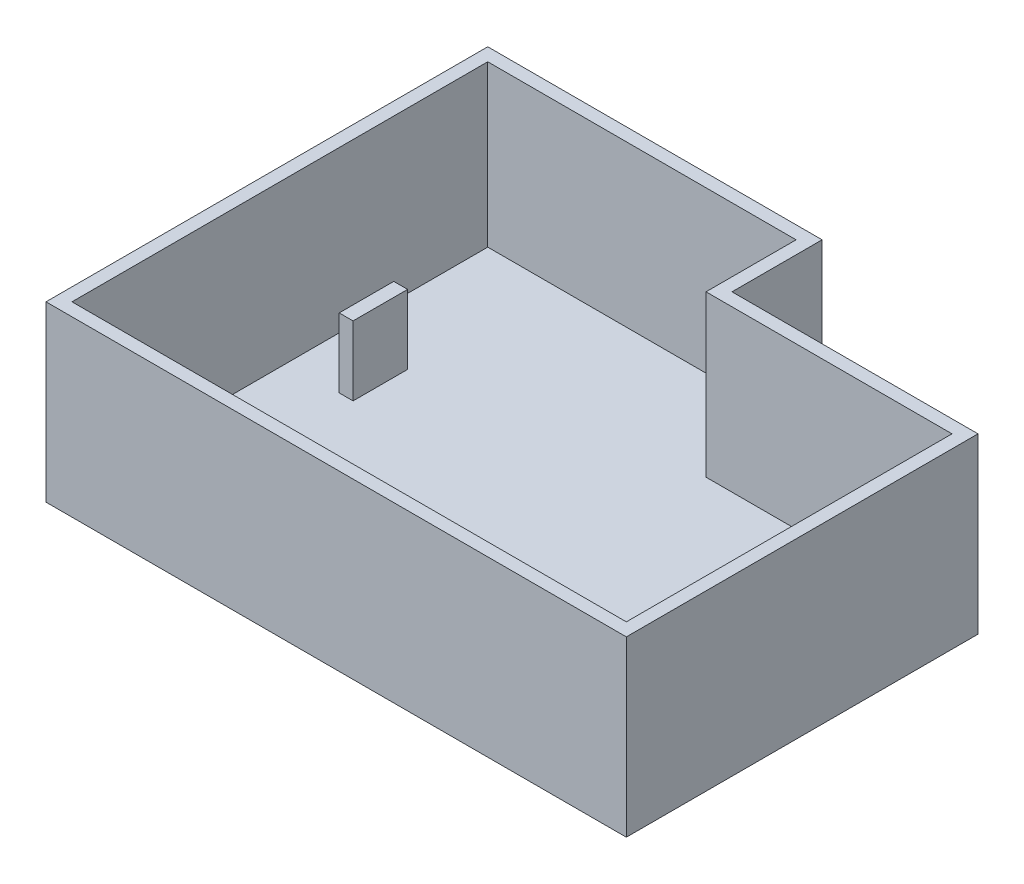
ISO-10303-21;
HEADER;
FILE_DESCRIPTION(('STEP AP214'),'2;1');
FILE_NAME('part.step','',(''),(''),'','','');
FILE_SCHEMA(('AUTOMOTIVE_DESIGN { 1 0 10303 214 1 1 1 1 }'));
ENDSEC;
DATA;
#1=APPLICATION_CONTEXT('core data for automotive mechanical design processes');
#2=APPLICATION_PROTOCOL_DEFINITION('international standard','automotive_design',2000,#1);
#3=PRODUCT_CONTEXT('',#1,'mechanical');
#4=PRODUCT('Part','Part','',(#3));
#5=PRODUCT_RELATED_PRODUCT_CATEGORY('part','',(#4));
#6=PRODUCT_DEFINITION_FORMATION('','',#4);
#7=PRODUCT_DEFINITION_CONTEXT('part definition',#1,'design');
#8=PRODUCT_DEFINITION('design','',#6,#7);
#9=PRODUCT_DEFINITION_SHAPE('','',#8);
#10=(LENGTH_UNIT() NAMED_UNIT(*) SI_UNIT(.MILLI.,.METRE.));
#11=(NAMED_UNIT(*) PLANE_ANGLE_UNIT() SI_UNIT($,.RADIAN.));
#12=(NAMED_UNIT(*) SI_UNIT($,.STERADIAN.) SOLID_ANGLE_UNIT());
#13=UNCERTAINTY_MEASURE_WITH_UNIT(LENGTH_MEASURE(1.E-05),#10,'distance_accuracy_value','');
#14=(GEOMETRIC_REPRESENTATION_CONTEXT(3) GLOBAL_UNCERTAINTY_ASSIGNED_CONTEXT((#13)) GLOBAL_UNIT_ASSIGNED_CONTEXT((#10,
#11,#12)) REPRESENTATION_CONTEXT('',''));
#15=CARTESIAN_POINT('',(0.,0.,0.));
#16=DIRECTION('',(0.,0.,1.));
#17=DIRECTION('',(1.,0.,0.));
#18=AXIS2_PLACEMENT_3D('',#15,#16,#17);
#19=CARTESIAN_POINT('',(0.,4.7625,0.));
#20=DIRECTION('',(0.,1.,0.));
#21=DIRECTION('',(0.,0.,1.));
#22=AXIS2_PLACEMENT_3D('',#19,#20,#21);
#23=PLANE('',#22);
#24=DIRECTION('',(-1.,0.,0.));
#25=VECTOR('',#24,1.);
#26=CARTESIAN_POINT('',(0.,4.7625,-10.));
#27=LINE('',#26,#25);
#28=CARTESIAN_POINT('',(-77.4699999999999,4.7625,-10.));
#29=VERTEX_POINT('',#28);
#30=CARTESIAN_POINT('',(-82.5499999999999,4.7625,-10.));
#31=VERTEX_POINT('',#30);
#32=EDGE_CURVE('E148',#29,#31,#27,.T.);
#33=ORIENTED_EDGE('',*,*,#32,.F.);
#34=DIRECTION('',(0.,0.,-1.));
#35=VECTOR('',#34,1.);
#36=CARTESIAN_POINT('',(-77.4699999999999,4.7625,-17.8901525748163));
#37=LINE('',#36,#35);
#38=CARTESIAN_POINT('',(-77.4699999999999,4.7625,9.99999999999999));
#39=VERTEX_POINT('',#38);
#40=EDGE_CURVE('E285',#39,#29,#37,.T.);
#41=ORIENTED_EDGE('',*,*,#40,.F.);
#42=DIRECTION('',(-1.,0.,0.));
#43=VECTOR('',#42,1.);
#44=CARTESIAN_POINT('',(0.,4.7625,9.99999999999996));
#45=LINE('',#44,#43);
#46=CARTESIAN_POINT('',(-82.5499999999999,4.7625,10.));
#47=VERTEX_POINT('',#46);
#48=EDGE_CURVE('E152',#39,#47,#45,.T.);
#49=ORIENTED_EDGE('',*,*,#48,.T.);
#50=DIRECTION('',(0.,0.,-1.));
#51=VECTOR('',#50,1.);
#52=CARTESIAN_POINT('',(-82.5499999999999,4.7625,0.));
#53=LINE('',#52,#51);
#54=EDGE_CURVE('E155',#47,#31,#53,.T.);
#55=ORIENTED_EDGE('',*,*,#54,.T.);
#56=EDGE_LOOP('',(#33,#41,#49,#55));
#57=FACE_BOUND('',#56,.T.);
#58=DIRECTION('',(1.,0.,0.));
#59=VECTOR('',#58,1.);
#60=CARTESIAN_POINT('',(0.,4.7625,38.575));
#61=LINE('',#60,#59);
#62=CARTESIAN_POINT('',(77.4700000000001,4.7625,38.575));
#63=VERTEX_POINT('',#62);
#64=CARTESIAN_POINT('',(82.5500000000001,4.7625,38.575));
#65=VERTEX_POINT('',#64);
#66=EDGE_CURVE('E218',#63,#65,#61,.T.);
#67=ORIENTED_EDGE('',*,*,#66,.F.);
#68=DIRECTION('',(0.,0.,1.));
#69=VECTOR('',#68,1.);
#70=CARTESIAN_POINT('',(77.4700000000001,4.7625,-17.8901525748163));
#71=LINE('',#70,#69);
#72=CARTESIAN_POINT('',(77.4700000000001,4.7625,18.575));
#73=VERTEX_POINT('',#72);
#74=EDGE_CURVE('E288',#73,#63,#71,.T.);
#75=ORIENTED_EDGE('',*,*,#74,.F.);
#76=DIRECTION('',(1.,0.,0.));
#77=VECTOR('',#76,1.);
#78=CARTESIAN_POINT('',(0.,4.7625,18.575));
#79=LINE('',#78,#77);
#80=CARTESIAN_POINT('',(82.5500000000001,4.7625,18.575));
#81=VERTEX_POINT('',#80);
#82=EDGE_CURVE('E211',#73,#81,#79,.T.);
#83=ORIENTED_EDGE('',*,*,#82,.T.);
#84=DIRECTION('',(0.,0.,-1.));
#85=VECTOR('',#84,1.);
#86=CARTESIAN_POINT('',(82.5500000000001,4.7625,0.));
#87=LINE('',#86,#85);
#88=EDGE_CURVE('E215',#65,#81,#87,.T.);
#89=ORIENTED_EDGE('',*,*,#88,.F.);
#90=EDGE_LOOP('',(#67,#75,#83,#89));
#91=FACE_BOUND('',#90,.T.);
#92=DIRECTION('',(0.,0.,-1.));
#93=VECTOR('',#92,1.);
#94=CARTESIAN_POINT('',(-10.,4.7625,0.));
#95=LINE('',#94,#93);
#96=CARTESIAN_POINT('',(-9.99999999999999,4.7625,69.85));
#97=VERTEX_POINT('',#96);
#98=CARTESIAN_POINT('',(-9.99999999999999,4.7625,64.77));
#99=VERTEX_POINT('',#98);
#100=EDGE_CURVE('E180',#97,#99,#95,.T.);
#101=ORIENTED_EDGE('',*,*,#100,.T.);
#102=DIRECTION('',(-1.,0.,0.));
#103=VECTOR('',#102,1.);
#104=CARTESIAN_POINT('',(-77.4699999999999,4.7625,64.77));
#105=LINE('',#104,#103);
#106=CARTESIAN_POINT('',(10.,4.7625,64.77));
#107=VERTEX_POINT('',#106);
#108=EDGE_CURVE('E272',#107,#99,#105,.T.);
#109=ORIENTED_EDGE('',*,*,#108,.F.);
#110=DIRECTION('',(0.,0.,-1.));
#111=VECTOR('',#110,1.);
#112=CARTESIAN_POINT('',(10.,4.7625,0.));
#113=LINE('',#112,#111);
#114=CARTESIAN_POINT('',(10.,4.7625,69.85));
#115=VERTEX_POINT('',#114);
#116=EDGE_CURVE('E53',#115,#107,#113,.T.);
#117=ORIENTED_EDGE('',*,*,#116,.F.);
#118=DIRECTION('',(1.,0.,0.));
#119=VECTOR('',#118,1.);
#120=CARTESIAN_POINT('',(0.,4.7625,69.85));
#121=LINE('',#120,#119);
#122=EDGE_CURVE('E185',#97,#115,#121,.T.);
#123=ORIENTED_EDGE('',*,*,#122,.F.);
#124=EDGE_LOOP('',(#101,#109,#117,#123));
#125=FACE_BOUND('',#124,.T.);
#126=DIRECTION('',(0.,0.,1.));
#127=VECTOR('',#126,1.);
#128=CARTESIAN_POINT('',(11.4300000000001,4.7625,0.));
#129=LINE('',#128,#127);
#130=CARTESIAN_POINT('',(11.4300000000001,4.7625,-63.5));
#131=VERTEX_POINT('',#130);
#132=CARTESIAN_POINT('',(11.4300000000001,4.7625,-30.48));
#133=VERTEX_POINT('',#132);
#134=EDGE_CURVE('E234',#131,#133,#129,.T.);
#135=ORIENTED_EDGE('',*,*,#134,.F.);
#136=DIRECTION('',(1.,0.,0.));
#137=VECTOR('',#136,1.);
#138=CARTESIAN_POINT('',(0.,4.7625,-63.5));
#139=LINE('',#138,#137);
#140=CARTESIAN_POINT('',(-101.6,4.7625,-63.5));
#141=VERTEX_POINT('',#140);
#142=EDGE_CURVE('E132',#141,#131,#139,.T.);
#143=ORIENTED_EDGE('',*,*,#142,.F.);
#144=DIRECTION('',(0.,0.,-1.));
#145=VECTOR('',#144,1.);
#146=CARTESIAN_POINT('',(-101.6,4.7625,0.));
#147=LINE('',#146,#145);
#148=CARTESIAN_POINT('',(-101.6,4.7625,88.9));
#149=VERTEX_POINT('',#148);
#150=EDGE_CURVE('E127',#149,#141,#147,.T.);
#151=ORIENTED_EDGE('',*,*,#150,.F.);
#152=DIRECTION('',(1.,0.,0.));
#153=VECTOR('',#152,1.);
#154=CARTESIAN_POINT('',(0.,4.7625,88.9));
#155=LINE('',#154,#153);
#156=CARTESIAN_POINT('',(101.6,4.7625,88.9));
#157=VERTEX_POINT('',#156);
#158=EDGE_CURVE('E122',#149,#157,#155,.T.);
#159=ORIENTED_EDGE('',*,*,#158,.T.);
#160=DIRECTION('',(0.,0.,-1.));
#161=VECTOR('',#160,1.);
#162=CARTESIAN_POINT('',(101.6,4.7625,0.));
#163=LINE('',#162,#161);
#164=CARTESIAN_POINT('',(101.6,4.7625,-30.48));
#165=VERTEX_POINT('',#164);
#166=EDGE_CURVE('E119',#157,#165,#163,.T.);
#167=ORIENTED_EDGE('',*,*,#166,.T.);
#168=DIRECTION('',(1.,0.,0.));
#169=VECTOR('',#168,1.);
#170=CARTESIAN_POINT('',(0.,4.7625,-30.48));
#171=LINE('',#170,#169);
#172=EDGE_CURVE('E221',#133,#165,#171,.T.);
#173=ORIENTED_EDGE('',*,*,#172,.F.);
#174=EDGE_LOOP('',(#135,#143,#151,#159,#167,#173));
#175=FACE_BOUND('',#174,.T.);
#176=ADVANCED_FACE('F38',(#57,#91,#125,#175),#23,.T.);
#177=CARTESIAN_POINT('',(0.,63.607999784,0.));
#178=DIRECTION('',(0.,1.,0.));
#179=DIRECTION('',(0.,0.,1.));
#180=AXIS2_PLACEMENT_3D('',#177,#178,#179);
#181=PLANE('',#180);
#182=DIRECTION('',(0.,0.,-1.));
#183=VECTOR('',#182,1.);
#184=CARTESIAN_POINT('',(16.1925000000001,63.607999784,-93.6625));
#185=LINE('',#184,#183);
#186=CARTESIAN_POINT('',(16.1925000000001,63.607999784,-35.2425));
#187=VERTEX_POINT('',#186);
#188=CARTESIAN_POINT('',(16.1925000000001,63.607999784,-68.2625));
#189=VERTEX_POINT('',#188);
#190=EDGE_CURVE('E237',#187,#189,#185,.T.);
#191=ORIENTED_EDGE('',*,*,#190,.T.);
#192=DIRECTION('',(-1.,0.,0.));
#193=VECTOR('',#192,1.);
#194=CARTESIAN_POINT('',(-106.3625,63.607999784,-68.2625));
#195=LINE('',#194,#193);
#196=CARTESIAN_POINT('',(-106.3625,63.607999784,-68.2625));
#197=VERTEX_POINT('',#196);
#198=EDGE_CURVE('E276',#189,#197,#195,.T.);
#199=ORIENTED_EDGE('',*,*,#198,.T.);
#200=DIRECTION('',(0.,0.,-1.));
#201=VECTOR('',#200,1.);
#202=CARTESIAN_POINT('',(-106.3625,63.607999784,0.));
#203=LINE('',#202,#201);
#204=CARTESIAN_POINT('',(-106.3625,63.607999784,93.6625));
#205=VERTEX_POINT('',#204);
#206=EDGE_CURVE('E100',#205,#197,#203,.T.);
#207=ORIENTED_EDGE('',*,*,#206,.F.);
#208=DIRECTION('',(1.,0.,0.));
#209=VECTOR('',#208,1.);
#210=CARTESIAN_POINT('',(0.,63.607999784,93.6625));
#211=LINE('',#210,#209);
#212=CARTESIAN_POINT('',(106.3625,63.607999784,93.6625));
#213=VERTEX_POINT('',#212);
#214=EDGE_CURVE('E62',#205,#213,#211,.T.);
#215=ORIENTED_EDGE('',*,*,#214,.T.);
#216=DIRECTION('',(0.,0.,-1.));
#217=VECTOR('',#216,1.);
#218=CARTESIAN_POINT('',(106.3625,63.607999784,0.));
#219=LINE('',#218,#217);
#220=CARTESIAN_POINT('',(106.3625,63.607999784,-35.2425));
#221=VERTEX_POINT('',#220);
#222=EDGE_CURVE('E93',#213,#221,#219,.T.);
#223=ORIENTED_EDGE('',*,*,#222,.T.);
#224=DIRECTION('',(-1.,0.,0.));
#225=VECTOR('',#224,1.);
#226=CARTESIAN_POINT('',(16.1925000000001,63.607999784,-35.2425));
#227=LINE('',#226,#225);
#228=EDGE_CURVE('E254',#221,#187,#227,.T.);
#229=ORIENTED_EDGE('',*,*,#228,.T.);
#230=EDGE_LOOP('',(#191,#199,#207,#215,#223,#229));
#231=FACE_BOUND('',#230,.T.);
#232=DIRECTION('',(1.,0.,0.));
#233=VECTOR('',#232,1.);
#234=CARTESIAN_POINT('',(-106.3625,63.607999784,-63.5));
#235=LINE('',#234,#233);
#236=CARTESIAN_POINT('',(-101.6,63.607999784,-63.5));
#237=VERTEX_POINT('',#236);
#238=CARTESIAN_POINT('',(11.4300000000001,63.607999784,-63.5));
#239=VERTEX_POINT('',#238);
#240=EDGE_CURVE('E267',#237,#239,#235,.T.);
#241=ORIENTED_EDGE('',*,*,#240,.T.);
#242=DIRECTION('',(0.,0.,1.));
#243=VECTOR('',#242,1.);
#244=CARTESIAN_POINT('',(11.4300000000001,63.607999784,-30.48));
#245=LINE('',#244,#243);
#246=CARTESIAN_POINT('',(11.4300000000001,63.607999784,-30.48));
#247=VERTEX_POINT('',#246);
#248=EDGE_CURVE('E248',#239,#247,#245,.T.);
#249=ORIENTED_EDGE('',*,*,#248,.T.);
#250=DIRECTION('',(1.,0.,0.));
#251=VECTOR('',#250,1.);
#252=CARTESIAN_POINT('',(106.3625,63.607999784,-30.48));
#253=LINE('',#252,#251);
#254=CARTESIAN_POINT('',(101.6,63.607999784,-30.48));
#255=VERTEX_POINT('',#254);
#256=EDGE_CURVE('E251',#247,#255,#253,.T.);
#257=ORIENTED_EDGE('',*,*,#256,.T.);
#258=DIRECTION('',(0.,0.,-1.));
#259=VECTOR('',#258,1.);
#260=CARTESIAN_POINT('',(101.6,63.607999784,0.));
#261=LINE('',#260,#259);
#262=CARTESIAN_POINT('',(101.6,63.607999784,88.9));
#263=VERTEX_POINT('',#262);
#264=EDGE_CURVE('E109',#263,#255,#261,.T.);
#265=ORIENTED_EDGE('',*,*,#264,.F.);
#266=DIRECTION('',(1.,0.,0.));
#267=VECTOR('',#266,1.);
#268=CARTESIAN_POINT('',(0.,63.607999784,88.9));
#269=LINE('',#268,#267);
#270=CARTESIAN_POINT('',(-101.6,63.607999784,88.9));
#271=VERTEX_POINT('',#270);
#272=EDGE_CURVE('E113',#271,#263,#269,.T.);
#273=ORIENTED_EDGE('',*,*,#272,.F.);
#274=DIRECTION('',(0.,0.,-1.));
#275=VECTOR('',#274,1.);
#276=CARTESIAN_POINT('',(-101.6,63.607999784,0.));
#277=LINE('',#276,#275);
#278=EDGE_CURVE('E116',#271,#237,#277,.T.);
#279=ORIENTED_EDGE('',*,*,#278,.T.);
#280=EDGE_LOOP('',(#241,#249,#257,#265,#273,#279));
#281=FACE_BOUND('',#280,.T.);
#282=ADVANCED_FACE('F375',(#231,#281),#181,.T.);
#283=CARTESIAN_POINT('',(-106.3625,63.607999784,0.));
#284=DIRECTION('',(-1.,0.,0.));
#285=DIRECTION('',(0.,0.,1.));
#286=AXIS2_PLACEMENT_3D('',#283,#284,#285);
#287=PLANE('',#286);
#288=ORIENTED_EDGE('',*,*,#206,.T.);
#289=DIRECTION('',(0.,-1.,0.));
#290=VECTOR('',#289,1.);
#291=CARTESIAN_POINT('',(-106.3625,186.255500497427,-68.2625));
#292=LINE('',#291,#290);
#293=CARTESIAN_POINT('',(-106.3625,0.,-68.2625));
#294=VERTEX_POINT('',#293);
#295=EDGE_CURVE('E268',#197,#294,#292,.T.);
#296=ORIENTED_EDGE('',*,*,#295,.T.);
#297=DIRECTION('',(0.,0.,-1.));
#298=VECTOR('',#297,1.);
#299=CARTESIAN_POINT('',(-106.3625,0.,0.));
#300=LINE('',#299,#298);
#301=CARTESIAN_POINT('',(-106.3625,0.,93.6625));
#302=VERTEX_POINT('',#301);
#303=EDGE_CURVE('E85',#302,#294,#300,.T.);
#304=ORIENTED_EDGE('',*,*,#303,.F.);
#305=DIRECTION('',(0.,-1.,0.));
#306=VECTOR('',#305,1.);
#307=CARTESIAN_POINT('',(-106.3625,63.607999784,93.6625));
#308=LINE('',#307,#306);
#309=EDGE_CURVE('E46',#205,#302,#308,.T.);
#310=ORIENTED_EDGE('',*,*,#309,.F.);
#311=EDGE_LOOP('',(#288,#296,#304,#310));
#312=FACE_BOUND('',#311,.T.);
#313=ADVANCED_FACE('F40',(#312),#287,.T.);
#314=CARTESIAN_POINT('',(0.,0.,0.));
#315=DIRECTION('',(0.,1.,0.));
#316=DIRECTION('',(0.,0.,1.));
#317=AXIS2_PLACEMENT_3D('',#314,#315,#316);
#318=PLANE('',#317);
#319=ORIENTED_EDGE('',*,*,#303,.T.);
#320=DIRECTION('',(-1.,0.,0.));
#321=VECTOR('',#320,1.);
#322=CARTESIAN_POINT('',(-106.3625,0.,-68.2625));
#323=LINE('',#322,#321);
#324=CARTESIAN_POINT('',(16.1925000000001,0.,-68.2625));
#325=VERTEX_POINT('',#324);
#326=EDGE_CURVE('E275',#325,#294,#323,.T.);
#327=ORIENTED_EDGE('',*,*,#326,.F.);
#328=DIRECTION('',(0.,0.,-1.));
#329=VECTOR('',#328,1.);
#330=CARTESIAN_POINT('',(16.1925000000001,0.,-93.6625));
#331=LINE('',#330,#329);
#332=CARTESIAN_POINT('',(16.1925000000001,0.,-35.2425));
#333=VERTEX_POINT('',#332);
#334=EDGE_CURVE('E241',#333,#325,#331,.T.);
#335=ORIENTED_EDGE('',*,*,#334,.F.);
#336=DIRECTION('',(-1.,0.,0.));
#337=VECTOR('',#336,1.);
#338=CARTESIAN_POINT('',(16.1925000000001,0.,-35.2425));
#339=LINE('',#338,#337);
#340=CARTESIAN_POINT('',(106.3625,0.,-35.2425));
#341=VERTEX_POINT('',#340);
#342=EDGE_CURVE('E99',#341,#333,#339,.T.);
#343=ORIENTED_EDGE('',*,*,#342,.F.);
#344=DIRECTION('',(0.,0.,-1.));
#345=VECTOR('',#344,1.);
#346=CARTESIAN_POINT('',(106.3625,0.,0.));
#347=LINE('',#346,#345);
#348=CARTESIAN_POINT('',(106.3625,0.,93.6625));
#349=VERTEX_POINT('',#348);
#350=EDGE_CURVE('E84',#349,#341,#347,.T.);
#351=ORIENTED_EDGE('',*,*,#350,.F.);
#352=DIRECTION('',(1.,0.,0.));
#353=VECTOR('',#352,1.);
#354=CARTESIAN_POINT('',(0.,0.,93.6625));
#355=LINE('',#354,#353);
#356=EDGE_CURVE('E75',#302,#349,#355,.T.);
#357=ORIENTED_EDGE('',*,*,#356,.F.);
#358=EDGE_LOOP('',(#319,#327,#335,#343,#351,#357));
#359=FACE_BOUND('',#358,.T.);
#360=ADVANCED_FACE('F96',(#359),#318,.F.);
#361=CARTESIAN_POINT('',(-101.6,63.607999784,0.));
#362=DIRECTION('',(-1.,0.,0.));
#363=DIRECTION('',(0.,0.,1.));
#364=AXIS2_PLACEMENT_3D('',#361,#362,#363);
#365=PLANE('',#364);
#366=DIRECTION('',(0.,-1.,0.));
#367=VECTOR('',#366,1.);
#368=CARTESIAN_POINT('',(-101.6,63.607999784,-63.5));
#369=LINE('',#368,#367);
#370=EDGE_CURVE('E247',#237,#141,#369,.T.);
#371=ORIENTED_EDGE('',*,*,#370,.F.);
#372=ORIENTED_EDGE('',*,*,#278,.F.);
#373=DIRECTION('',(0.,-1.,0.));
#374=VECTOR('',#373,1.);
#375=CARTESIAN_POINT('',(-101.6,63.607999784,88.9));
#376=LINE('',#375,#374);
#377=EDGE_CURVE('E106',#271,#149,#376,.T.);
#378=ORIENTED_EDGE('',*,*,#377,.T.);
#379=ORIENTED_EDGE('',*,*,#150,.T.);
#380=EDGE_LOOP('',(#371,#372,#378,#379));
#381=FACE_BOUND('',#380,.T.);
#382=ADVANCED_FACE('F469',(#381),#365,.F.);
#383=CARTESIAN_POINT('',(11.4300000000001,177.643993498704,-30.48));
#384=DIRECTION('',(1.,0.,0.));
#385=DIRECTION('',(0.,0.,-1.));
#386=AXIS2_PLACEMENT_3D('',#383,#384,#385);
#387=PLANE('',#386);
#388=DIRECTION('',(0.,1.,0.));
#389=VECTOR('',#388,1.);
#390=CARTESIAN_POINT('',(11.4300000000001,177.643993498704,-63.5));
#391=LINE('',#390,#389);
#392=EDGE_CURVE('E264',#131,#239,#391,.T.);
#393=ORIENTED_EDGE('',*,*,#392,.F.);
#394=ORIENTED_EDGE('',*,*,#134,.T.);
#395=DIRECTION('',(0.,-1.,0.));
#396=VECTOR('',#395,1.);
#397=CARTESIAN_POINT('',(11.4300000000001,177.643993498704,-30.48));
#398=LINE('',#397,#396);
#399=EDGE_CURVE('E244',#247,#133,#398,.T.);
#400=ORIENTED_EDGE('',*,*,#399,.F.);
#401=ORIENTED_EDGE('',*,*,#248,.F.);
#402=EDGE_LOOP('',(#393,#394,#400,#401));
#403=FACE_BOUND('',#402,.T.);
#404=ADVANCED_FACE('F390',(#403),#387,.F.);
#405=CARTESIAN_POINT('',(16.1925000000001,177.643993498704,-93.6625));
#406=DIRECTION('',(-1.,0.,0.));
#407=DIRECTION('',(0.,0.,1.));
#408=AXIS2_PLACEMENT_3D('',#405,#406,#407);
#409=PLANE('',#408);
#410=ORIENTED_EDGE('',*,*,#334,.T.);
#411=DIRECTION('',(0.,-1.,0.));
#412=VECTOR('',#411,1.);
#413=CARTESIAN_POINT('',(16.1925000000001,186.255500497427,-68.2625));
#414=LINE('',#413,#412);
#415=EDGE_CURVE('E271',#189,#325,#414,.T.);
#416=ORIENTED_EDGE('',*,*,#415,.F.);
#417=ORIENTED_EDGE('',*,*,#190,.F.);
#418=DIRECTION('',(0.,-1.,0.));
#419=VECTOR('',#418,1.);
#420=CARTESIAN_POINT('',(16.1925000000001,177.643993498704,-35.2425));
#421=LINE('',#420,#419);
#422=EDGE_CURVE('E238',#187,#333,#421,.T.);
#423=ORIENTED_EDGE('',*,*,#422,.T.);
#424=EDGE_LOOP('',(#410,#416,#417,#423));
#425=FACE_BOUND('',#424,.T.);
#426=ADVANCED_FACE('F472',(#425),#409,.F.);
#427=CARTESIAN_POINT('',(0.,63.607999784,93.6625));
#428=DIRECTION('',(0.,0.,-1.));
#429=DIRECTION('',(-1.,0.,0.));
#430=AXIS2_PLACEMENT_3D('',#427,#428,#429);
#431=PLANE('',#430);
#432=ORIENTED_EDGE('',*,*,#356,.T.);
#433=DIRECTION('',(0.,-1.,0.));
#434=VECTOR('',#433,1.);
#435=CARTESIAN_POINT('',(106.3625,63.607999784,93.6625));
#436=LINE('',#435,#434);
#437=EDGE_CURVE('E78',#213,#349,#436,.T.);
#438=ORIENTED_EDGE('',*,*,#437,.F.);
#439=ORIENTED_EDGE('',*,*,#214,.F.);
#440=ORIENTED_EDGE('',*,*,#309,.T.);
#441=EDGE_LOOP('',(#432,#438,#439,#440));
#442=FACE_BOUND('',#441,.T.);
#443=ADVANCED_FACE('F77',(#442),#431,.F.);
#444=CARTESIAN_POINT('',(106.3625,63.607999784,0.));
#445=DIRECTION('',(-1.,0.,0.));
#446=DIRECTION('',(0.,0.,1.));
#447=AXIS2_PLACEMENT_3D('',#444,#445,#446);
#448=PLANE('',#447);
#449=ORIENTED_EDGE('',*,*,#350,.T.);
#450=DIRECTION('',(0.,-1.,0.));
#451=VECTOR('',#450,1.);
#452=CARTESIAN_POINT('',(106.3625,177.643993498704,-35.2425));
#453=LINE('',#452,#451);
#454=EDGE_CURVE('E242',#221,#341,#453,.T.);
#455=ORIENTED_EDGE('',*,*,#454,.F.);
#456=ORIENTED_EDGE('',*,*,#222,.F.);
#457=ORIENTED_EDGE('',*,*,#437,.T.);
#458=EDGE_LOOP('',(#449,#455,#456,#457));
#459=FACE_BOUND('',#458,.T.);
#460=ADVANCED_FACE('F89',(#459),#448,.F.);
#461=CARTESIAN_POINT('',(0.,63.607999784,88.9));
#462=DIRECTION('',(0.,0.,-1.));
#463=DIRECTION('',(-1.,0.,0.));
#464=AXIS2_PLACEMENT_3D('',#461,#462,#463);
#465=PLANE('',#464);
#466=ORIENTED_EDGE('',*,*,#158,.F.);
#467=ORIENTED_EDGE('',*,*,#377,.F.);
#468=ORIENTED_EDGE('',*,*,#272,.T.);
#469=DIRECTION('',(0.,-1.,0.));
#470=VECTOR('',#469,1.);
#471=CARTESIAN_POINT('',(101.6,63.607999784,88.9));
#472=LINE('',#471,#470);
#473=EDGE_CURVE('E112',#263,#157,#472,.T.);
#474=ORIENTED_EDGE('',*,*,#473,.T.);
#475=EDGE_LOOP('',(#466,#467,#468,#474));
#476=FACE_BOUND('',#475,.T.);
#477=ADVANCED_FACE('F366',(#476),#465,.T.);
#478=CARTESIAN_POINT('',(101.6,63.607999784,0.));
#479=DIRECTION('',(-1.,0.,0.));
#480=DIRECTION('',(0.,0.,1.));
#481=AXIS2_PLACEMENT_3D('',#478,#479,#480);
#482=PLANE('',#481);
#483=DIRECTION('',(0.,1.,0.));
#484=VECTOR('',#483,1.);
#485=CARTESIAN_POINT('',(101.6,63.607999784,-30.48));
#486=LINE('',#485,#484);
#487=EDGE_CURVE('E11',#165,#255,#486,.T.);
#488=ORIENTED_EDGE('',*,*,#487,.F.);
#489=ORIENTED_EDGE('',*,*,#166,.F.);
#490=ORIENTED_EDGE('',*,*,#473,.F.);
#491=ORIENTED_EDGE('',*,*,#264,.T.);
#492=EDGE_LOOP('',(#488,#489,#490,#491));
#493=FACE_BOUND('',#492,.T.);
#494=ADVANCED_FACE('F373',(#493),#482,.T.);
#495=CARTESIAN_POINT('',(-82.5499999999999,30.1625,0.));
#496=DIRECTION('',(-1.,0.,0.));
#497=DIRECTION('',(0.,0.,1.));
#498=AXIS2_PLACEMENT_3D('',#495,#496,#497);
#499=PLANE('',#498);
#500=ORIENTED_EDGE('',*,*,#54,.F.);
#501=DIRECTION('',(0.,-1.,0.));
#502=VECTOR('',#501,1.);
#503=CARTESIAN_POINT('',(-82.5499999999999,30.1625,10.));
#504=LINE('',#503,#502);
#505=CARTESIAN_POINT('',(-82.5499999999999,30.1625,10.));
#506=VERTEX_POINT('',#505);
#507=EDGE_CURVE('E135',#506,#47,#504,.T.);
#508=ORIENTED_EDGE('',*,*,#507,.F.);
#509=DIRECTION('',(0.,0.,-1.));
#510=VECTOR('',#509,1.);
#511=CARTESIAN_POINT('',(-82.5499999999999,30.1625,0.));
#512=LINE('',#511,#510);
#513=CARTESIAN_POINT('',(-82.5499999999999,30.1625,-10.));
#514=VERTEX_POINT('',#513);
#515=EDGE_CURVE('E151',#506,#514,#512,.T.);
#516=ORIENTED_EDGE('',*,*,#515,.T.);
#517=DIRECTION('',(0.,-1.,0.));
#518=VECTOR('',#517,1.);
#519=CARTESIAN_POINT('',(-82.5499999999999,30.1625,-10.));
#520=LINE('',#519,#518);
#521=EDGE_CURVE('E144',#514,#31,#520,.T.);
#522=ORIENTED_EDGE('',*,*,#521,.T.);
#523=EDGE_LOOP('',(#500,#508,#516,#522));
#524=FACE_BOUND('',#523,.T.);
#525=ADVANCED_FACE('F440',(#524),#499,.T.);
#526=CARTESIAN_POINT('',(0.,30.1625,9.99999999999996));
#527=DIRECTION('',(0.,0.,1.));
#528=DIRECTION('',(1.,0.,0.));
#529=AXIS2_PLACEMENT_3D('',#526,#527,#528);
#530=PLANE('',#529);
#531=ORIENTED_EDGE('',*,*,#48,.F.);
#532=DIRECTION('',(0.,-1.,0.));
#533=VECTOR('',#532,1.);
#534=CARTESIAN_POINT('',(-77.4699999999999,30.1625,9.99999999999999));
#535=LINE('',#534,#533);
#536=CARTESIAN_POINT('',(-77.4699999999999,30.1625,9.99999999999999));
#537=VERTEX_POINT('',#536);
#538=EDGE_CURVE('E138',#537,#39,#535,.T.);
#539=ORIENTED_EDGE('',*,*,#538,.F.);
#540=DIRECTION('',(-1.,0.,0.));
#541=VECTOR('',#540,1.);
#542=CARTESIAN_POINT('',(0.,30.1625,9.99999999999996));
#543=LINE('',#542,#541);
#544=EDGE_CURVE('E164',#537,#506,#543,.T.);
#545=ORIENTED_EDGE('',*,*,#544,.T.);
#546=ORIENTED_EDGE('',*,*,#507,.T.);
#547=EDGE_LOOP('',(#531,#539,#545,#546));
#548=FACE_BOUND('',#547,.T.);
#549=ADVANCED_FACE('F436',(#548),#530,.T.);
#550=CARTESIAN_POINT('',(-77.4699999999999,30.1625,0.));
#551=DIRECTION('',(1.,0.,0.));
#552=DIRECTION('',(0.,0.,-1.));
#553=AXIS2_PLACEMENT_3D('',#550,#551,#552);
#554=PLANE('',#553);
#555=ORIENTED_EDGE('',*,*,#538,.T.);
#556=ORIENTED_EDGE('',*,*,#40,.T.);
#557=DIRECTION('',(0.,-1.,0.));
#558=VECTOR('',#557,1.);
#559=CARTESIAN_POINT('',(-77.4699999999999,30.1625,-10.));
#560=LINE('',#559,#558);
#561=CARTESIAN_POINT('',(-77.4699999999999,30.1625,-10.));
#562=VERTEX_POINT('',#561);
#563=EDGE_CURVE('E141',#562,#29,#560,.T.);
#564=ORIENTED_EDGE('',*,*,#563,.F.);
#565=DIRECTION('',(0.,0.,1.));
#566=VECTOR('',#565,1.);
#567=CARTESIAN_POINT('',(-77.4699999999999,30.1625,0.));
#568=LINE('',#567,#566);
#569=EDGE_CURVE('E161',#562,#537,#568,.T.);
#570=ORIENTED_EDGE('',*,*,#569,.T.);
#571=EDGE_LOOP('',(#555,#556,#564,#570));
#572=FACE_BOUND('',#571,.T.);
#573=ADVANCED_FACE('F429',(#572),#554,.T.);
#574=CARTESIAN_POINT('',(0.,30.1625,-10.));
#575=DIRECTION('',(0.,0.,1.));
#576=DIRECTION('',(1.,0.,0.));
#577=AXIS2_PLACEMENT_3D('',#574,#575,#576);
#578=PLANE('',#577);
#579=ORIENTED_EDGE('',*,*,#563,.T.);
#580=ORIENTED_EDGE('',*,*,#32,.T.);
#581=ORIENTED_EDGE('',*,*,#521,.F.);
#582=DIRECTION('',(-1.,0.,0.));
#583=VECTOR('',#582,1.);
#584=CARTESIAN_POINT('',(0.,30.1625,-10.));
#585=LINE('',#584,#583);
#586=EDGE_CURVE('E147',#562,#514,#585,.T.);
#587=ORIENTED_EDGE('',*,*,#586,.F.);
#588=EDGE_LOOP('',(#579,#580,#581,#587));
#589=FACE_BOUND('',#588,.T.);
#590=ADVANCED_FACE('F444',(#589),#578,.F.);
#591=CARTESIAN_POINT('',(0.,30.1625,0.));
#592=DIRECTION('',(0.,1.,0.));
#593=DIRECTION('',(0.,0.,1.));
#594=AXIS2_PLACEMENT_3D('',#591,#592,#593);
#595=PLANE('',#594);
#596=ORIENTED_EDGE('',*,*,#515,.F.);
#597=ORIENTED_EDGE('',*,*,#544,.F.);
#598=ORIENTED_EDGE('',*,*,#569,.F.);
#599=ORIENTED_EDGE('',*,*,#586,.T.);
#600=EDGE_LOOP('',(#596,#597,#598,#599));
#601=FACE_BOUND('',#600,.T.);
#602=ADVANCED_FACE('F446',(#601),#595,.T.);
#603=CARTESIAN_POINT('',(0.,30.1625,69.85));
#604=DIRECTION('',(0.,0.,-1.));
#605=DIRECTION('',(-1.,0.,0.));
#606=AXIS2_PLACEMENT_3D('',#603,#604,#605);
#607=PLANE('',#606);
#608=ORIENTED_EDGE('',*,*,#122,.T.);
#609=DIRECTION('',(0.,-1.,0.));
#610=VECTOR('',#609,1.);
#611=CARTESIAN_POINT('',(10.,30.1625,69.85));
#612=LINE('',#611,#610);
#613=CARTESIAN_POINT('',(10.,30.1625,69.85));
#614=VERTEX_POINT('',#613);
#615=EDGE_CURVE('E158',#614,#115,#612,.T.);
#616=ORIENTED_EDGE('',*,*,#615,.F.);
#617=DIRECTION('',(1.,0.,0.));
#618=VECTOR('',#617,1.);
#619=CARTESIAN_POINT('',(0.,30.1625,69.85));
#620=LINE('',#619,#618);
#621=CARTESIAN_POINT('',(-9.99999999999999,30.1625,69.85));
#622=VERTEX_POINT('',#621);
#623=EDGE_CURVE('E183',#622,#614,#620,.T.);
#624=ORIENTED_EDGE('',*,*,#623,.F.);
#625=DIRECTION('',(0.,-1.,0.));
#626=VECTOR('',#625,1.);
#627=CARTESIAN_POINT('',(-9.99999999999999,30.1625,69.85));
#628=LINE('',#627,#626);
#629=EDGE_CURVE('E176',#622,#97,#628,.T.);
#630=ORIENTED_EDGE('',*,*,#629,.T.);
#631=EDGE_LOOP('',(#608,#616,#624,#630));
#632=FACE_BOUND('',#631,.T.);
#633=ADVANCED_FACE('F448',(#632),#607,.F.);
#634=CARTESIAN_POINT('',(10.,30.1625,0.));
#635=DIRECTION('',(-1.,0.,0.));
#636=DIRECTION('',(0.,0.,1.));
#637=AXIS2_PLACEMENT_3D('',#634,#635,#636);
#638=PLANE('',#637);
#639=ORIENTED_EDGE('',*,*,#116,.T.);
#640=DIRECTION('',(0.,-1.,0.));
#641=VECTOR('',#640,1.);
#642=CARTESIAN_POINT('',(10.,30.1625,64.77));
#643=LINE('',#642,#641);
#644=CARTESIAN_POINT('',(10.,30.1625,64.77));
#645=VERTEX_POINT('',#644);
#646=EDGE_CURVE('E170',#645,#107,#643,.T.);
#647=ORIENTED_EDGE('',*,*,#646,.F.);
#648=DIRECTION('',(0.,0.,-1.));
#649=VECTOR('',#648,1.);
#650=CARTESIAN_POINT('',(10.,30.1625,0.));
#651=LINE('',#650,#649);
#652=EDGE_CURVE('E194',#614,#645,#651,.T.);
#653=ORIENTED_EDGE('',*,*,#652,.F.);
#654=ORIENTED_EDGE('',*,*,#615,.T.);
#655=EDGE_LOOP('',(#639,#647,#653,#654));
#656=FACE_BOUND('',#655,.T.);
#657=ADVANCED_FACE('F454',(#656),#638,.F.);
#658=CARTESIAN_POINT('',(0.,30.1625,64.77));
#659=DIRECTION('',(0.,0.,1.));
#660=DIRECTION('',(1.,0.,0.));
#661=AXIS2_PLACEMENT_3D('',#658,#659,#660);
#662=PLANE('',#661);
#663=ORIENTED_EDGE('',*,*,#646,.T.);
#664=ORIENTED_EDGE('',*,*,#108,.T.);
#665=DIRECTION('',(0.,-1.,0.));
#666=VECTOR('',#665,1.);
#667=CARTESIAN_POINT('',(-9.99999999999999,30.1625,64.77));
#668=LINE('',#667,#666);
#669=CARTESIAN_POINT('',(-9.99999999999999,30.1625,64.77));
#670=VERTEX_POINT('',#669);
#671=EDGE_CURVE('E173',#670,#99,#668,.T.);
#672=ORIENTED_EDGE('',*,*,#671,.F.);
#673=DIRECTION('',(-1.,0.,0.));
#674=VECTOR('',#673,1.);
#675=CARTESIAN_POINT('',(0.,30.1625,64.77));
#676=LINE('',#675,#674);
#677=EDGE_CURVE('E191',#645,#670,#676,.T.);
#678=ORIENTED_EDGE('',*,*,#677,.F.);
#679=EDGE_LOOP('',(#663,#664,#672,#678));
#680=FACE_BOUND('',#679,.T.);
#681=ADVANCED_FACE('F511',(#680),#662,.F.);
#682=CARTESIAN_POINT('',(-10.,30.1625,0.));
#683=DIRECTION('',(-1.,0.,0.));
#684=DIRECTION('',(0.,0.,1.));
#685=AXIS2_PLACEMENT_3D('',#682,#683,#684);
#686=PLANE('',#685);
#687=ORIENTED_EDGE('',*,*,#671,.T.);
#688=ORIENTED_EDGE('',*,*,#100,.F.);
#689=ORIENTED_EDGE('',*,*,#629,.F.);
#690=DIRECTION('',(0.,0.,-1.));
#691=VECTOR('',#690,1.);
#692=CARTESIAN_POINT('',(-10.,30.1625,0.));
#693=LINE('',#692,#691);
#694=EDGE_CURVE('E179',#622,#670,#693,.T.);
#695=ORIENTED_EDGE('',*,*,#694,.T.);
#696=EDGE_LOOP('',(#687,#688,#689,#695));
#697=FACE_BOUND('',#696,.T.);
#698=ADVANCED_FACE('F507',(#697),#686,.T.);
#699=CARTESIAN_POINT('',(0.,30.1625,0.));
#700=DIRECTION('',(0.,1.,0.));
#701=DIRECTION('',(0.,0.,1.));
#702=AXIS2_PLACEMENT_3D('',#699,#700,#701);
#703=PLANE('',#702);
#704=ORIENTED_EDGE('',*,*,#623,.T.);
#705=ORIENTED_EDGE('',*,*,#652,.T.);
#706=ORIENTED_EDGE('',*,*,#677,.T.);
#707=ORIENTED_EDGE('',*,*,#694,.F.);
#708=EDGE_LOOP('',(#704,#705,#706,#707));
#709=FACE_BOUND('',#708,.T.);
#710=ADVANCED_FACE('F504',(#709),#703,.T.);
#711=CARTESIAN_POINT('',(0.,30.1625,38.575));
#712=DIRECTION('',(0.,0.,-1.));
#713=DIRECTION('',(-1.,0.,0.));
#714=AXIS2_PLACEMENT_3D('',#711,#712,#713);
#715=PLANE('',#714);
#716=DIRECTION('',(0.,-1.,0.));
#717=VECTOR('',#716,1.);
#718=CARTESIAN_POINT('',(77.4700000000001,30.1625,38.575));
#719=LINE('',#718,#717);
#720=CARTESIAN_POINT('',(77.4700000000001,30.1625,38.575));
#721=VERTEX_POINT('',#720);
#722=EDGE_CURVE('E207',#721,#63,#719,.T.);
#723=ORIENTED_EDGE('',*,*,#722,.T.);
#724=ORIENTED_EDGE('',*,*,#66,.T.);
#725=DIRECTION('',(0.,-1.,0.));
#726=VECTOR('',#725,1.);
#727=CARTESIAN_POINT('',(82.5500000000001,30.1625,38.575));
#728=LINE('',#727,#726);
#729=CARTESIAN_POINT('',(82.5500000000001,30.1625,38.575));
#730=VERTEX_POINT('',#729);
#731=EDGE_CURVE('E188',#730,#65,#728,.T.);
#732=ORIENTED_EDGE('',*,*,#731,.F.);
#733=DIRECTION('',(1.,0.,0.));
#734=VECTOR('',#733,1.);
#735=CARTESIAN_POINT('',(0.,30.1625,38.575));
#736=LINE('',#735,#734);
#737=EDGE_CURVE('E214',#721,#730,#736,.T.);
#738=ORIENTED_EDGE('',*,*,#737,.F.);
#739=EDGE_LOOP('',(#723,#724,#732,#738));
#740=FACE_BOUND('',#739,.T.);
#741=ADVANCED_FACE('F309',(#740),#715,.F.);
#742=CARTESIAN_POINT('',(82.5500000000001,30.1625,0.));
#743=DIRECTION('',(-1.,0.,0.));
#744=DIRECTION('',(0.,0.,1.));
#745=AXIS2_PLACEMENT_3D('',#742,#743,#744);
#746=PLANE('',#745);
#747=ORIENTED_EDGE('',*,*,#88,.T.);
#748=DIRECTION('',(0.,-1.,0.));
#749=VECTOR('',#748,1.);
#750=CARTESIAN_POINT('',(82.5500000000001,30.1625,18.575));
#751=LINE('',#750,#749);
#752=CARTESIAN_POINT('',(82.5500000000001,30.1625,18.575));
#753=VERTEX_POINT('',#752);
#754=EDGE_CURVE('E201',#753,#81,#751,.T.);
#755=ORIENTED_EDGE('',*,*,#754,.F.);
#756=DIRECTION('',(0.,0.,-1.));
#757=VECTOR('',#756,1.);
#758=CARTESIAN_POINT('',(82.5500000000001,30.1625,0.));
#759=LINE('',#758,#757);
#760=EDGE_CURVE('E227',#730,#753,#759,.T.);
#761=ORIENTED_EDGE('',*,*,#760,.F.);
#762=ORIENTED_EDGE('',*,*,#731,.T.);
#763=EDGE_LOOP('',(#747,#755,#761,#762));
#764=FACE_BOUND('',#763,.T.);
#765=ADVANCED_FACE('F316',(#764),#746,.F.);
#766=CARTESIAN_POINT('',(0.,30.1625,18.575));
#767=DIRECTION('',(0.,0.,-1.));
#768=DIRECTION('',(-1.,0.,0.));
#769=AXIS2_PLACEMENT_3D('',#766,#767,#768);
#770=PLANE('',#769);
#771=ORIENTED_EDGE('',*,*,#82,.F.);
#772=DIRECTION('',(0.,-1.,0.));
#773=VECTOR('',#772,1.);
#774=CARTESIAN_POINT('',(77.4700000000001,30.1625,18.575));
#775=LINE('',#774,#773);
#776=CARTESIAN_POINT('',(77.4700000000001,30.1625,18.575));
#777=VERTEX_POINT('',#776);
#778=EDGE_CURVE('E204',#777,#73,#775,.T.);
#779=ORIENTED_EDGE('',*,*,#778,.F.);
#780=DIRECTION('',(1.,0.,0.));
#781=VECTOR('',#780,1.);
#782=CARTESIAN_POINT('',(0.,30.1625,18.575));
#783=LINE('',#782,#781);
#784=EDGE_CURVE('E224',#777,#753,#783,.T.);
#785=ORIENTED_EDGE('',*,*,#784,.T.);
#786=ORIENTED_EDGE('',*,*,#754,.T.);
#787=EDGE_LOOP('',(#771,#779,#785,#786));
#788=FACE_BOUND('',#787,.T.);
#789=ADVANCED_FACE('F496',(#788),#770,.T.);
#790=CARTESIAN_POINT('',(77.4700000000001,30.1625,0.));
#791=DIRECTION('',(1.,0.,0.));
#792=DIRECTION('',(0.,0.,-1.));
#793=AXIS2_PLACEMENT_3D('',#790,#791,#792);
#794=PLANE('',#793);
#795=ORIENTED_EDGE('',*,*,#778,.T.);
#796=ORIENTED_EDGE('',*,*,#74,.T.);
#797=ORIENTED_EDGE('',*,*,#722,.F.);
#798=DIRECTION('',(0.,0.,1.));
#799=VECTOR('',#798,1.);
#800=CARTESIAN_POINT('',(77.4700000000001,30.1625,0.));
#801=LINE('',#800,#799);
#802=EDGE_CURVE('E210',#777,#721,#801,.T.);
#803=ORIENTED_EDGE('',*,*,#802,.F.);
#804=EDGE_LOOP('',(#795,#796,#797,#803));
#805=FACE_BOUND('',#804,.T.);
#806=ADVANCED_FACE('F295',(#805),#794,.F.);
#807=CARTESIAN_POINT('',(0.,30.1625,0.));
#808=DIRECTION('',(0.,1.,0.));
#809=DIRECTION('',(0.,0.,1.));
#810=AXIS2_PLACEMENT_3D('',#807,#808,#809);
#811=PLANE('',#810);
#812=ORIENTED_EDGE('',*,*,#737,.T.);
#813=ORIENTED_EDGE('',*,*,#760,.T.);
#814=ORIENTED_EDGE('',*,*,#784,.F.);
#815=ORIENTED_EDGE('',*,*,#802,.T.);
#816=EDGE_LOOP('',(#812,#813,#814,#815));
#817=FACE_BOUND('',#816,.T.);
#818=ADVANCED_FACE('F322',(#817),#811,.T.);
#819=CARTESIAN_POINT('',(106.3625,177.643993498704,-30.48));
#820=DIRECTION('',(0.,0.,-1.));
#821=DIRECTION('',(-1.,0.,0.));
#822=AXIS2_PLACEMENT_3D('',#819,#820,#821);
#823=PLANE('',#822);
#824=ORIENTED_EDGE('',*,*,#172,.T.);
#825=ORIENTED_EDGE('',*,*,#487,.T.);
#826=ORIENTED_EDGE('',*,*,#256,.F.);
#827=ORIENTED_EDGE('',*,*,#399,.T.);
#828=EDGE_LOOP('',(#824,#825,#826,#827));
#829=FACE_BOUND('',#828,.T.);
#830=ADVANCED_FACE('F384',(#829),#823,.F.);
#831=CARTESIAN_POINT('',(16.1925000000001,177.643993498704,-35.2425));
#832=DIRECTION('',(0.,0.,1.));
#833=DIRECTION('',(1.,0.,0.));
#834=AXIS2_PLACEMENT_3D('',#831,#832,#833);
#835=PLANE('',#834);
#836=ORIENTED_EDGE('',*,*,#228,.F.);
#837=ORIENTED_EDGE('',*,*,#454,.T.);
#838=ORIENTED_EDGE('',*,*,#342,.T.);
#839=ORIENTED_EDGE('',*,*,#422,.F.);
#840=EDGE_LOOP('',(#836,#837,#838,#839));
#841=FACE_BOUND('',#840,.T.);
#842=ADVANCED_FACE('F486',(#841),#835,.F.);
#843=CARTESIAN_POINT('',(-106.3625,186.255500497427,-63.5));
#844=DIRECTION('',(0.,0.,-1.));
#845=DIRECTION('',(-1.,0.,0.));
#846=AXIS2_PLACEMENT_3D('',#843,#844,#845);
#847=PLANE('',#846);
#848=ORIENTED_EDGE('',*,*,#142,.T.);
#849=ORIENTED_EDGE('',*,*,#392,.T.);
#850=ORIENTED_EDGE('',*,*,#240,.F.);
#851=ORIENTED_EDGE('',*,*,#370,.T.);
#852=EDGE_LOOP('',(#848,#849,#850,#851));
#853=FACE_BOUND('',#852,.T.);
#854=ADVANCED_FACE('F484',(#853),#847,.F.);
#855=CARTESIAN_POINT('',(-106.3625,186.255500497427,-68.2625));
#856=DIRECTION('',(0.,0.,1.));
#857=DIRECTION('',(1.,0.,0.));
#858=AXIS2_PLACEMENT_3D('',#855,#856,#857);
#859=PLANE('',#858);
#860=ORIENTED_EDGE('',*,*,#198,.F.);
#861=ORIENTED_EDGE('',*,*,#415,.T.);
#862=ORIENTED_EDGE('',*,*,#326,.T.);
#863=ORIENTED_EDGE('',*,*,#295,.F.);
#864=EDGE_LOOP('',(#860,#861,#862,#863));
#865=FACE_BOUND('',#864,.T.);
#866=ADVANCED_FACE('F579',(#865),#859,.F.);
#867=CLOSED_SHELL('',(#176,#282,#313,#360,#382,#404,#426,#443,#460,#477,#494,#525,#549,#573,
#590,#602,#633,#657,#681,#698,#710,#741,#765,#789,#806,#818,#830,#842,#854,#866));
#868=MANIFOLD_SOLID_BREP('B2',#867);
#869=ADVANCED_BREP_SHAPE_REPRESENTATION('',(#18,#868),#14);
#870=SHAPE_DEFINITION_REPRESENTATION(#9,#869);
ENDSEC;
END-ISO-10303-21;
